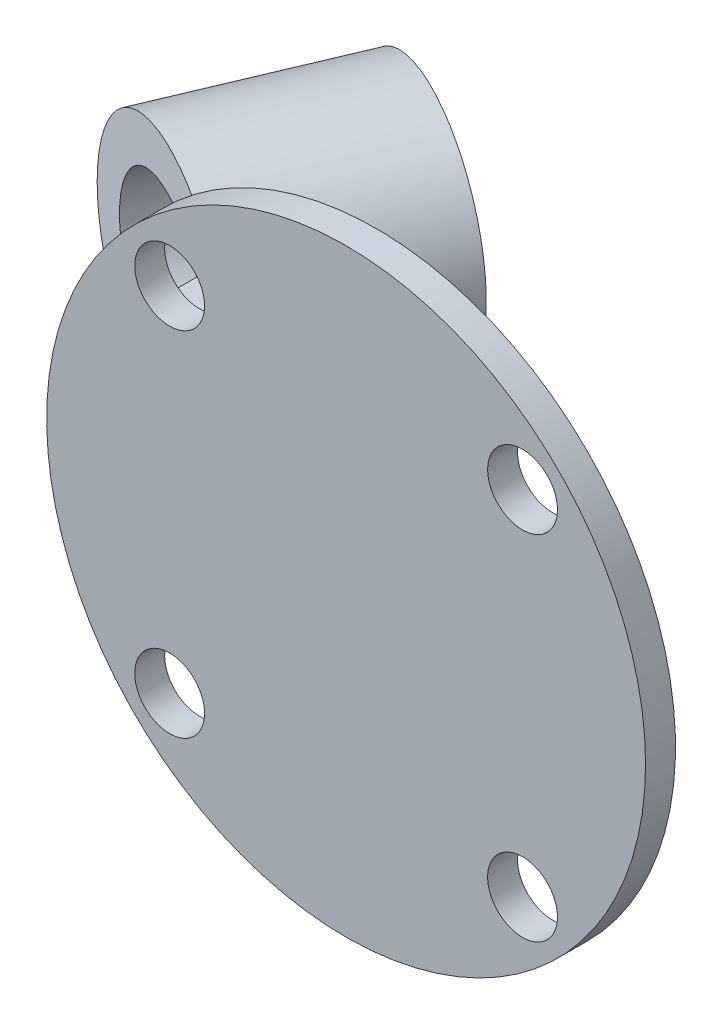
ISO-10303-21;
HEADER;
FILE_DESCRIPTION(('STEP AP214'),'2;1');
FILE_NAME('part.step','',(''),(''),'','','');
FILE_SCHEMA(('AUTOMOTIVE_DESIGN { 1 0 10303 214 1 1 1 1 }'));
ENDSEC;
DATA;
#1=APPLICATION_CONTEXT('core data for automotive mechanical design processes');
#2=APPLICATION_PROTOCOL_DEFINITION('international standard','automotive_design',2000,#1);
#3=PRODUCT_CONTEXT('',#1,'mechanical');
#4=PRODUCT('Part','Part','',(#3));
#5=PRODUCT_RELATED_PRODUCT_CATEGORY('part','',(#4));
#6=PRODUCT_DEFINITION_FORMATION('','',#4);
#7=PRODUCT_DEFINITION_CONTEXT('part definition',#1,'design');
#8=PRODUCT_DEFINITION('design','',#6,#7);
#9=PRODUCT_DEFINITION_SHAPE('','',#8);
#10=(LENGTH_UNIT() NAMED_UNIT(*) SI_UNIT(.MILLI.,.METRE.));
#11=(NAMED_UNIT(*) PLANE_ANGLE_UNIT() SI_UNIT($,.RADIAN.));
#12=(NAMED_UNIT(*) SI_UNIT($,.STERADIAN.) SOLID_ANGLE_UNIT());
#13=UNCERTAINTY_MEASURE_WITH_UNIT(LENGTH_MEASURE(1.E-05),#10,'distance_accuracy_value','');
#14=(GEOMETRIC_REPRESENTATION_CONTEXT(3) GLOBAL_UNCERTAINTY_ASSIGNED_CONTEXT((#13)) GLOBAL_UNIT_ASSIGNED_CONTEXT((#10,
#11,#12)) REPRESENTATION_CONTEXT('',''));
#15=CARTESIAN_POINT('',(0.,0.,0.));
#16=DIRECTION('',(0.,0.,1.));
#17=DIRECTION('',(1.,0.,0.));
#18=AXIS2_PLACEMENT_3D('',#15,#16,#17);
#19=CARTESIAN_POINT('',(-23.9445840321487,5.,-15.3333333333333));
#20=DIRECTION('',(-0.388888888888893,0.,0.921284663987609));
#21=DIRECTION('',(0.921284663987609,0.,0.388888888888893));
#22=AXIS2_PLACEMENT_3D('',#19,#20,#21);
#23=PLANE('',#22);
#24=CARTESIAN_POINT('',(-35.,0.,-20.));
#25=DIRECTION('',(-0.388888888888893,0.,0.921284663987609));
#26=DIRECTION('',(0.921284663987609,0.,0.388888888888893));
#27=AXIS2_PLACEMENT_3D('',#24,#25,#26);
#28=CIRCLE('',#27,12.);
#29=CARTESIAN_POINT('',(-23.9445840321487,0.,-15.3333333333333));
#30=VERTEX_POINT('',#29);
#31=CARTESIAN_POINT('',(-24.9499708249303,-5.,-15.7577230665305));
#32=VERTEX_POINT('',#31);
#33=EDGE_CURVE('E51',#30,#32,#28,.F.);
#34=ORIENTED_EDGE('',*,*,#33,.F.);
#35=DIRECTION('',(0.,-1.,0.));
#36=VECTOR('',#35,1.);
#37=CARTESIAN_POINT('',(-23.9445840321487,5.,-15.3333333333333));
#38=LINE('',#37,#36);
#39=CARTESIAN_POINT('',(-23.9445840321487,-5.,-15.3333333333333));
#40=VERTEX_POINT('',#39);
#41=EDGE_CURVE('E144',#30,#40,#38,.T.);
#42=ORIENTED_EDGE('',*,*,#41,.T.);
#43=DIRECTION('',(-0.921284663987609,0.,-0.388888888888893));
#44=VECTOR('',#43,1.);
#45=CARTESIAN_POINT('',(-23.9445840321487,-5.,-15.3333333333333));
#46=LINE('',#45,#44);
#47=EDGE_CURVE('E137',#40,#32,#46,.T.);
#48=ORIENTED_EDGE('',*,*,#47,.T.);
#49=EDGE_LOOP('',(#34,#42,#48));
#50=FACE_BOUND('',#49,.T.);
#51=ADVANCED_FACE('F36',(#50),#23,.F.);
#52=CARTESIAN_POINT('',(0.,5.,0.));
#53=DIRECTION('',(0.,-1.,0.));
#54=DIRECTION('',(0.,0.,-1.));
#55=AXIS2_PLACEMENT_3D('',#52,#53,#54);
#56=PLANE('',#55);
#57=DIRECTION('',(0.92128466398761,0.,0.388888888888891));
#58=VECTOR('',#57,1.);
#59=CARTESIAN_POINT('',(-0.0721069344173924,5.,0.170822604460895));
#60=LINE('',#59,#58);
#61=CARTESIAN_POINT('',(-29.7584240653411,5.,-12.3602433467286));
#62=VERTEX_POINT('',#61);
#63=CARTESIAN_POINT('',(-26.8944152693747,5.,-11.1512997465925));
#64=VERTEX_POINT('',#63);
#65=EDGE_CURVE('E107',#62,#64,#60,.T.);
#66=ORIENTED_EDGE('',*,*,#65,.F.);
#67=DIRECTION('',(0.,0.,1.));
#68=VECTOR('',#67,1.);
#69=CARTESIAN_POINT('',(-29.7584240653411,5.,-12.3602433467286));
#70=LINE('',#69,#68);
#71=CARTESIAN_POINT('',(-29.7584240653411,5.,0.));
#72=VERTEX_POINT('',#71);
#73=EDGE_CURVE('E134',#62,#72,#70,.T.);
#74=ORIENTED_EDGE('',*,*,#73,.T.);
#75=DIRECTION('',(1.,0.,0.));
#76=VECTOR('',#75,1.);
#77=CARTESIAN_POINT('',(-29.7584240653411,5.,0.));
#78=LINE('',#77,#76);
#79=CARTESIAN_POINT('',(-29.5803989154981,5.,0.));
#80=VERTEX_POINT('',#79);
#81=EDGE_CURVE('E136',#72,#80,#78,.T.);
#82=ORIENTED_EDGE('',*,*,#81,.T.);
#83=CARTESIAN_POINT('',(0.,5.,0.));
#84=VERTEX_POINT('',#83);
#85=EDGE_CURVE('E141',#80,#84,#78,.T.);
#86=ORIENTED_EDGE('',*,*,#85,.T.);
#87=DIRECTION('',(-0.842130858897415,0.,-0.539273229905493));
#88=VECTOR('',#87,1.);
#89=CARTESIAN_POINT('',(0.,5.,0.));
#90=LINE('',#89,#88);
#91=CARTESIAN_POINT('',(-23.9445840321487,5.,-15.3333333333333));
#92=VERTEX_POINT('',#91);
#93=EDGE_CURVE('E140',#84,#92,#90,.T.);
#94=ORIENTED_EDGE('',*,*,#93,.T.);
#95=DIRECTION('',(-0.921284663987609,0.,-0.388888888888893));
#96=VECTOR('',#95,1.);
#97=CARTESIAN_POINT('',(-23.9445840321487,5.,-15.3333333333333));
#98=LINE('',#97,#96);
#99=CARTESIAN_POINT('',(-24.9499708249303,5.,-15.7577230665305));
#100=VERTEX_POINT('',#99);
#101=EDGE_CURVE('E128',#92,#100,#98,.T.);
#102=ORIENTED_EDGE('',*,*,#101,.T.);
#103=DIRECTION('',(0.388888888888891,0.,-0.92128466398761));
#104=VECTOR('',#103,1.);
#105=CARTESIAN_POINT('',(-24.9499708249303,5.,-15.7577230665305));
#106=LINE('',#105,#104);
#107=EDGE_CURVE('E121',#64,#100,#106,.T.);
#108=ORIENTED_EDGE('',*,*,#107,.F.);
#109=EDGE_LOOP('',(#66,#74,#82,#86,#94,#102,#108));
#110=FACE_BOUND('',#109,.T.);
#111=ADVANCED_FACE('F126',(#110),#56,.F.);
#112=CARTESIAN_POINT('',(0.,-5.,0.));
#113=DIRECTION('',(0.,-1.,0.));
#114=DIRECTION('',(0.,0.,-1.));
#115=AXIS2_PLACEMENT_3D('',#112,#113,#114);
#116=PLANE('',#115);
#117=DIRECTION('',(0.,0.,1.));
#118=VECTOR('',#117,1.);
#119=CARTESIAN_POINT('',(-29.7584240653411,-5.,-12.3602433467286));
#120=LINE('',#119,#118);
#121=CARTESIAN_POINT('',(-29.7584240653411,-5.,-12.3602433467286));
#122=VERTEX_POINT('',#121);
#123=CARTESIAN_POINT('',(-29.7584240653411,-5.,0.));
#124=VERTEX_POINT('',#123);
#125=EDGE_CURVE('E117',#122,#124,#120,.T.);
#126=ORIENTED_EDGE('',*,*,#125,.F.);
#127=DIRECTION('',(0.92128466398761,0.,0.388888888888891));
#128=VECTOR('',#127,1.);
#129=CARTESIAN_POINT('',(-0.0721069344173924,-5.,0.170822604460895));
#130=LINE('',#129,#128);
#131=CARTESIAN_POINT('',(-26.8944152693747,-5.,-11.1512997465925));
#132=VERTEX_POINT('',#131);
#133=EDGE_CURVE('E11',#122,#132,#130,.T.);
#134=ORIENTED_EDGE('',*,*,#133,.T.);
#135=DIRECTION('',(0.388888888888891,0.,-0.92128466398761));
#136=VECTOR('',#135,1.);
#137=CARTESIAN_POINT('',(-24.9499708249303,-5.,-15.7577230665305));
#138=LINE('',#137,#136);
#139=EDGE_CURVE('E44',#132,#32,#138,.T.);
#140=ORIENTED_EDGE('',*,*,#139,.T.);
#141=ORIENTED_EDGE('',*,*,#47,.F.);
#142=DIRECTION('',(-0.842130858897415,0.,-0.539273229905493));
#143=VECTOR('',#142,1.);
#144=CARTESIAN_POINT('',(0.,-5.,0.));
#145=LINE('',#144,#143);
#146=CARTESIAN_POINT('',(0.,-5.,0.));
#147=VERTEX_POINT('',#146);
#148=EDGE_CURVE('E149',#147,#40,#145,.T.);
#149=ORIENTED_EDGE('',*,*,#148,.F.);
#150=DIRECTION('',(1.,0.,0.));
#151=VECTOR('',#150,1.);
#152=CARTESIAN_POINT('',(-29.7584240653411,-5.,0.));
#153=LINE('',#152,#151);
#154=CARTESIAN_POINT('',(-29.5803989154981,-5.,0.));
#155=VERTEX_POINT('',#154);
#156=EDGE_CURVE('E150',#155,#147,#153,.T.);
#157=ORIENTED_EDGE('',*,*,#156,.F.);
#158=EDGE_CURVE('E146',#124,#155,#153,.T.);
#159=ORIENTED_EDGE('',*,*,#158,.F.);
#160=EDGE_LOOP('',(#126,#134,#140,#141,#149,#157,#159));
#161=FACE_BOUND('',#160,.T.);
#162=ADVANCED_FACE('F216',(#161),#116,.T.);
#163=CARTESIAN_POINT('',(0.,0.,0.));
#164=DIRECTION('',(0.,0.,1.));
#165=DIRECTION('',(1.,0.,0.));
#166=AXIS2_PLACEMENT_3D('',#163,#164,#165);
#167=PLANE('',#166);
#168=CARTESIAN_POINT('',(-17.6776695296637,17.6776695296637,0.));
#169=DIRECTION('',(0.,0.,1.));
#170=DIRECTION('',(1.,0.,0.));
#171=AXIS2_PLACEMENT_3D('',#168,#169,#170);
#172=CIRCLE('',#171,3.5);
#173=CARTESIAN_POINT('',(-14.1776695296637,17.6776695296637,0.));
#174=VERTEX_POINT('',#173);
#175=EDGE_CURVE('E184',#174,#174,#172,.T.);
#176=ORIENTED_EDGE('',*,*,#175,.T.);
#177=EDGE_LOOP('',(#176));
#178=FACE_BOUND('',#177,.T.);
#179=CARTESIAN_POINT('',(17.6776695296637,17.6776695296637,0.));
#180=DIRECTION('',(0.,0.,1.));
#181=DIRECTION('',(-1.,0.,0.));
#182=AXIS2_PLACEMENT_3D('',#179,#180,#181);
#183=CIRCLE('',#182,3.5);
#184=CARTESIAN_POINT('',(14.1776695296637,17.6776695296637,0.));
#185=VERTEX_POINT('',#184);
#186=EDGE_CURVE('E166',#185,#185,#183,.T.);
#187=ORIENTED_EDGE('',*,*,#186,.T.);
#188=EDGE_LOOP('',(#187));
#189=FACE_BOUND('',#188,.T.);
#190=CARTESIAN_POINT('',(17.6776695296637,-17.6776695296637,0.));
#191=DIRECTION('',(0.,0.,1.));
#192=DIRECTION('',(1.,0.,0.));
#193=AXIS2_PLACEMENT_3D('',#190,#191,#192);
#194=CIRCLE('',#193,3.5);
#195=CARTESIAN_POINT('',(21.1776695296637,-17.6776695296637,0.));
#196=VERTEX_POINT('',#195);
#197=EDGE_CURVE('E173',#196,#196,#194,.T.);
#198=ORIENTED_EDGE('',*,*,#197,.T.);
#199=EDGE_LOOP('',(#198));
#200=FACE_BOUND('',#199,.T.);
#201=CARTESIAN_POINT('',(-17.6776695296637,-17.6776695296637,0.));
#202=DIRECTION('',(0.,0.,1.));
#203=DIRECTION('',(-1.,0.,0.));
#204=AXIS2_PLACEMENT_3D('',#201,#202,#203);
#205=CIRCLE('',#204,3.5);
#206=CARTESIAN_POINT('',(-21.1776695296637,-17.6776695296637,0.));
#207=VERTEX_POINT('',#206);
#208=EDGE_CURVE('E179',#207,#207,#205,.T.);
#209=ORIENTED_EDGE('',*,*,#208,.T.);
#210=EDGE_LOOP('',(#209));
#211=FACE_BOUND('',#210,.T.);
#212=CARTESIAN_POINT('',(0.,0.,0.));
#213=DIRECTION('',(0.,0.,1.));
#214=DIRECTION('',(1.,0.,0.));
#215=AXIS2_PLACEMENT_3D('',#212,#213,#214);
#216=CIRCLE('',#215,30.);
#217=EDGE_CURVE('E187',#155,#80,#216,.T.);
#218=ORIENTED_EDGE('',*,*,#217,.F.);
#219=ORIENTED_EDGE('',*,*,#156,.T.);
#220=DIRECTION('',(0.,-1.,0.));
#221=VECTOR('',#220,1.);
#222=CARTESIAN_POINT('',(0.,5.,0.));
#223=LINE('',#222,#221);
#224=EDGE_CURVE('E158',#84,#147,#223,.T.);
#225=ORIENTED_EDGE('',*,*,#224,.F.);
#226=ORIENTED_EDGE('',*,*,#85,.F.);
#227=EDGE_LOOP('',(#218,#219,#225,#226));
#228=FACE_BOUND('',#227,.T.);
#229=ADVANCED_FACE('F222',(#178,#189,#200,#211,#228),#167,.F.);
#230=CARTESIAN_POINT('',(0.,0.,3.));
#231=DIRECTION('',(0.,0.,-1.));
#232=DIRECTION('',(-1.,0.,0.));
#233=AXIS2_PLACEMENT_3D('',#230,#231,#232);
#234=CYLINDRICAL_SURFACE('',#233,30.);
#235=CARTESIAN_POINT('',(0.,0.,3.));
#236=DIRECTION('',(0.,0.,1.));
#237=DIRECTION('',(1.,0.,0.));
#238=AXIS2_PLACEMENT_3D('',#235,#236,#237);
#239=CIRCLE('',#238,30.);
#240=CARTESIAN_POINT('',(30.,0.,3.));
#241=VERTEX_POINT('',#240);
#242=EDGE_CURVE('E190',#241,#241,#239,.T.);
#243=ORIENTED_EDGE('',*,*,#242,.F.);
#244=EDGE_LOOP('',(#243));
#245=FACE_BOUND('',#244,.T.);
#246=CARTESIAN_POINT('',(-29.7584240653411,3.79949959169974,0.));
#247=VERTEX_POINT('',#246);
#248=EDGE_CURVE('E193',#80,#247,#216,.T.);
#249=ORIENTED_EDGE('',*,*,#248,.T.);
#250=CARTESIAN_POINT('',(-29.7584240653411,-3.79949959169974,0.));
#251=VERTEX_POINT('',#250);
#252=EDGE_CURVE('E195',#247,#251,#216,.T.);
#253=ORIENTED_EDGE('',*,*,#252,.T.);
#254=EDGE_CURVE('E212',#251,#155,#216,.T.);
#255=ORIENTED_EDGE('',*,*,#254,.T.);
#256=ORIENTED_EDGE('',*,*,#217,.T.);
#257=EDGE_LOOP('',(#249,#253,#255,#256));
#258=FACE_BOUND('',#257,.T.);
#259=ADVANCED_FACE('F38',(#245,#258),#234,.T.);
#260=CARTESIAN_POINT('',(0.,0.,3.));
#261=DIRECTION('',(0.,0.,1.));
#262=DIRECTION('',(1.,0.,0.));
#263=AXIS2_PLACEMENT_3D('',#260,#261,#262);
#264=PLANE('',#263);
#265=CARTESIAN_POINT('',(-17.6776695296637,-17.6776695296637,3.));
#266=DIRECTION('',(0.,0.,1.));
#267=DIRECTION('',(-1.,0.,0.));
#268=AXIS2_PLACEMENT_3D('',#265,#266,#267);
#269=CIRCLE('',#268,3.5);
#270=CARTESIAN_POINT('',(-21.1776695296637,-17.6776695296637,3.));
#271=VERTEX_POINT('',#270);
#272=EDGE_CURVE('E165',#271,#271,#269,.T.);
#273=ORIENTED_EDGE('',*,*,#272,.F.);
#274=EDGE_LOOP('',(#273));
#275=FACE_BOUND('',#274,.T.);
#276=CARTESIAN_POINT('',(17.6776695296637,-17.6776695296637,3.));
#277=DIRECTION('',(0.,0.,1.));
#278=DIRECTION('',(1.,0.,0.));
#279=AXIS2_PLACEMENT_3D('',#276,#277,#278);
#280=CIRCLE('',#279,3.5);
#281=CARTESIAN_POINT('',(21.1776695296637,-17.6776695296637,3.));
#282=VERTEX_POINT('',#281);
#283=EDGE_CURVE('E176',#282,#282,#280,.T.);
#284=ORIENTED_EDGE('',*,*,#283,.F.);
#285=EDGE_LOOP('',(#284));
#286=FACE_BOUND('',#285,.T.);
#287=CARTESIAN_POINT('',(17.6776695296637,17.6776695296637,3.));
#288=DIRECTION('',(0.,0.,1.));
#289=DIRECTION('',(-1.,0.,0.));
#290=AXIS2_PLACEMENT_3D('',#287,#288,#289);
#291=CIRCLE('',#290,3.5);
#292=CARTESIAN_POINT('',(14.1776695296637,17.6776695296637,3.));
#293=VERTEX_POINT('',#292);
#294=EDGE_CURVE('E170',#293,#293,#291,.T.);
#295=ORIENTED_EDGE('',*,*,#294,.F.);
#296=EDGE_LOOP('',(#295));
#297=FACE_BOUND('',#296,.T.);
#298=CARTESIAN_POINT('',(-17.6776695296637,17.6776695296637,3.));
#299=DIRECTION('',(0.,0.,1.));
#300=DIRECTION('',(1.,0.,0.));
#301=AXIS2_PLACEMENT_3D('',#298,#299,#300);
#302=CIRCLE('',#301,3.5);
#303=CARTESIAN_POINT('',(-14.1776695296637,17.6776695296637,3.));
#304=VERTEX_POINT('',#303);
#305=EDGE_CURVE('E169',#304,#304,#302,.T.);
#306=ORIENTED_EDGE('',*,*,#305,.F.);
#307=EDGE_LOOP('',(#306));
#308=FACE_BOUND('',#307,.T.);
#309=ORIENTED_EDGE('',*,*,#242,.T.);
#310=EDGE_LOOP('',(#309));
#311=FACE_BOUND('',#310,.T.);
#312=ADVANCED_FACE('F228',(#275,#286,#297,#308,#311),#264,.T.);
#313=ORIENTED_EDGE('',*,*,#252,.F.);
#314=DIRECTION('',(0.,-1.,0.));
#315=VECTOR('',#314,1.);
#316=CARTESIAN_POINT('',(-29.7584240653411,5.,0.));
#317=LINE('',#316,#315);
#318=EDGE_CURVE('E163',#247,#251,#317,.T.);
#319=ORIENTED_EDGE('',*,*,#318,.T.);
#320=EDGE_LOOP('',(#313,#319));
#321=FACE_BOUND('',#320,.T.);
#322=ADVANCED_FACE('F225',(#321),#167,.F.);
#323=CARTESIAN_POINT('',(-17.6776695296637,17.6776695296637,0.));
#324=DIRECTION('',(0.,0.,1.));
#325=DIRECTION('',(1.,0.,0.));
#326=AXIS2_PLACEMENT_3D('',#323,#324,#325);
#327=CYLINDRICAL_SURFACE('',#326,3.5);
#328=ORIENTED_EDGE('',*,*,#175,.F.);
#329=EDGE_LOOP('',(#328));
#330=FACE_BOUND('',#329,.T.);
#331=ORIENTED_EDGE('',*,*,#305,.T.);
#332=EDGE_LOOP('',(#331));
#333=FACE_BOUND('',#332,.T.);
#334=ADVANCED_FACE('F227',(#330,#333),#327,.F.);
#335=CARTESIAN_POINT('',(17.6776695296637,17.6776695296637,0.));
#336=DIRECTION('',(0.,0.,1.));
#337=DIRECTION('',(1.,0.,0.));
#338=AXIS2_PLACEMENT_3D('',#335,#336,#337);
#339=CYLINDRICAL_SURFACE('',#338,3.5);
#340=ORIENTED_EDGE('',*,*,#186,.F.);
#341=EDGE_LOOP('',(#340));
#342=FACE_BOUND('',#341,.T.);
#343=ORIENTED_EDGE('',*,*,#294,.T.);
#344=EDGE_LOOP('',(#343));
#345=FACE_BOUND('',#344,.T.);
#346=ADVANCED_FACE('F233',(#342,#345),#339,.F.);
#347=CARTESIAN_POINT('',(17.6776695296637,-17.6776695296637,0.));
#348=DIRECTION('',(0.,0.,1.));
#349=DIRECTION('',(1.,0.,0.));
#350=AXIS2_PLACEMENT_3D('',#347,#348,#349);
#351=CYLINDRICAL_SURFACE('',#350,3.5);
#352=ORIENTED_EDGE('',*,*,#197,.F.);
#353=EDGE_LOOP('',(#352));
#354=FACE_BOUND('',#353,.T.);
#355=ORIENTED_EDGE('',*,*,#283,.T.);
#356=EDGE_LOOP('',(#355));
#357=FACE_BOUND('',#356,.T.);
#358=ADVANCED_FACE('F267',(#354,#357),#351,.F.);
#359=CARTESIAN_POINT('',(-17.6776695296637,-17.6776695296637,0.));
#360=DIRECTION('',(0.,0.,1.));
#361=DIRECTION('',(1.,0.,0.));
#362=AXIS2_PLACEMENT_3D('',#359,#360,#361);
#363=CYLINDRICAL_SURFACE('',#362,3.5);
#364=ORIENTED_EDGE('',*,*,#208,.F.);
#365=EDGE_LOOP('',(#364));
#366=FACE_BOUND('',#365,.T.);
#367=ORIENTED_EDGE('',*,*,#272,.T.);
#368=EDGE_LOOP('',(#367));
#369=FACE_BOUND('',#368,.T.);
#370=ADVANCED_FACE('F271',(#366,#369),#363,.F.);
#371=CARTESIAN_POINT('',(-29.7584240653411,5.,0.));
#372=DIRECTION('',(0.,0.,-1.));
#373=DIRECTION('',(-1.,0.,0.));
#374=AXIS2_PLACEMENT_3D('',#371,#372,#373);
#375=PLANE('',#374);
#376=ORIENTED_EDGE('',*,*,#248,.F.);
#377=ORIENTED_EDGE('',*,*,#81,.F.);
#378=EDGE_CURVE('E160',#72,#247,#317,.T.);
#379=ORIENTED_EDGE('',*,*,#378,.T.);
#380=EDGE_LOOP('',(#376,#377,#379));
#381=FACE_BOUND('',#380,.T.);
#382=ADVANCED_FACE('F261',(#381),#375,.F.);
#383=CARTESIAN_POINT('',(-29.7584240653411,5.,-12.3602433467286));
#384=DIRECTION('',(1.,0.,0.));
#385=DIRECTION('',(0.,0.,-1.));
#386=AXIS2_PLACEMENT_3D('',#383,#384,#385);
#387=PLANE('',#386);
#388=ORIENTED_EDGE('',*,*,#125,.T.);
#389=EDGE_CURVE('E59',#251,#124,#317,.T.);
#390=ORIENTED_EDGE('',*,*,#389,.F.);
#391=ORIENTED_EDGE('',*,*,#318,.F.);
#392=ORIENTED_EDGE('',*,*,#378,.F.);
#393=ORIENTED_EDGE('',*,*,#73,.F.);
#394=DIRECTION('',(0.,-1.,0.));
#395=VECTOR('',#394,1.);
#396=CARTESIAN_POINT('',(-29.7584240653411,5.,-12.3602433467286));
#397=LINE('',#396,#395);
#398=CARTESIAN_POINT('',(-29.7584240653411,0.,-12.3602433467286));
#399=VERTEX_POINT('',#398);
#400=EDGE_CURVE('E113',#62,#399,#397,.T.);
#401=ORIENTED_EDGE('',*,*,#400,.T.);
#402=DIRECTION('',(0.,1.,0.));
#403=VECTOR('',#402,1.);
#404=CARTESIAN_POINT('',(-29.7584240653411,5.,-12.3602433467286));
#405=LINE('',#404,#403);
#406=EDGE_CURVE('E118',#122,#399,#405,.T.);
#407=ORIENTED_EDGE('',*,*,#406,.F.);
#408=EDGE_LOOP('',(#388,#390,#391,#392,#393,#401,#407));
#409=FACE_BOUND('',#408,.T.);
#410=ADVANCED_FACE('F215',(#409),#387,.F.);
#411=ORIENTED_EDGE('',*,*,#254,.F.);
#412=ORIENTED_EDGE('',*,*,#389,.T.);
#413=ORIENTED_EDGE('',*,*,#158,.T.);
#414=EDGE_LOOP('',(#411,#412,#413));
#415=FACE_BOUND('',#414,.T.);
#416=ADVANCED_FACE('F209',(#415),#375,.F.);
#417=CARTESIAN_POINT('',(0.,5.,0.));
#418=DIRECTION('',(-0.539273229905493,0.,0.842130858897415));
#419=DIRECTION('',(0.842130858897415,0.,0.539273229905493));
#420=AXIS2_PLACEMENT_3D('',#417,#418,#419);
#421=PLANE('',#420);
#422=ORIENTED_EDGE('',*,*,#148,.T.);
#423=ORIENTED_EDGE('',*,*,#41,.F.);
#424=EDGE_CURVE('E155',#92,#30,#38,.T.);
#425=ORIENTED_EDGE('',*,*,#424,.F.);
#426=ORIENTED_EDGE('',*,*,#93,.F.);
#427=ORIENTED_EDGE('',*,*,#224,.T.);
#428=EDGE_LOOP('',(#422,#423,#425,#426,#427));
#429=FACE_BOUND('',#428,.T.);
#430=ADVANCED_FACE('F220',(#429),#421,.F.);
#431=EDGE_CURVE('E129',#100,#30,#28,.F.);
#432=ORIENTED_EDGE('',*,*,#431,.F.);
#433=ORIENTED_EDGE('',*,*,#101,.F.);
#434=ORIENTED_EDGE('',*,*,#424,.T.);
#435=EDGE_LOOP('',(#432,#433,#434));
#436=FACE_BOUND('',#435,.T.);
#437=ADVANCED_FACE('F243',(#436),#23,.F.);
#438=CARTESIAN_POINT('',(-29.7584240653411,0.,-12.3602433467286));
#439=DIRECTION('',(0.388888888888891,0.,-0.92128466398761));
#440=DIRECTION('',(-0.92128466398761,0.,-0.388888888888891));
#441=AXIS2_PLACEMENT_3D('',#438,#439,#440);
#442=PLANE('',#441);
#443=ORIENTED_EDGE('',*,*,#400,.F.);
#444=ORIENTED_EDGE('',*,*,#65,.T.);
#445=CARTESIAN_POINT('',(-36.9444444444445,0.,-15.3935766800619));
#446=DIRECTION('',(0.388888888888891,0.,-0.92128466398761));
#447=DIRECTION('',(-0.92128466398761,0.,-0.388888888888891));
#448=AXIS2_PLACEMENT_3D('',#445,#446,#447);
#449=CIRCLE('',#448,12.);
#450=EDGE_CURVE('E110',#132,#64,#449,.T.);
#451=ORIENTED_EDGE('',*,*,#450,.F.);
#452=ORIENTED_EDGE('',*,*,#133,.F.);
#453=ORIENTED_EDGE('',*,*,#406,.T.);
#454=CARTESIAN_POINT('',(-36.9444444444445,0.,-15.3935766800619));
#455=DIRECTION('',(0.388888888888891,0.,-0.92128466398761));
#456=DIRECTION('',(-0.92128466398761,0.,-0.388888888888891));
#457=AXIS2_PLACEMENT_3D('',#454,#455,#456);
#458=CIRCLE('',#457,7.79999999999999);
#459=EDGE_CURVE('E386',#399,#399,#458,.T.);
#460=ORIENTED_EDGE('',*,*,#459,.T.);
#461=EDGE_LOOP('',(#443,#444,#451,#452,#453,#460));
#462=FACE_BOUND('',#461,.T.);
#463=ADVANCED_FACE('F109',(#462),#442,.F.);
#464=CARTESIAN_POINT('',(-35.,0.,-20.));
#465=DIRECTION('',(0.388888888888891,0.,-0.92128466398761));
#466=DIRECTION('',(-0.92128466398761,0.,-0.388888888888891));
#467=AXIS2_PLACEMENT_3D('',#464,#465,#466);
#468=CYLINDRICAL_SURFACE('',#467,12.);
#469=CARTESIAN_POINT('',(-29.1666666666666,0.,-33.8192699598141));
#470=DIRECTION('',(0.388888888888891,0.,-0.92128466398761));
#471=DIRECTION('',(-0.92128466398761,0.,-0.388888888888891));
#472=AXIS2_PLACEMENT_3D('',#469,#470,#471);
#473=CIRCLE('',#472,12.);
#474=CARTESIAN_POINT('',(-40.222082634518,0.,-38.4859366264808));
#475=VERTEX_POINT('',#474);
#476=EDGE_CURVE('E123',#475,#475,#473,.T.);
#477=ORIENTED_EDGE('',*,*,#476,.F.);
#478=EDGE_LOOP('',(#477));
#479=FACE_BOUND('',#478,.T.);
#480=ORIENTED_EDGE('',*,*,#450,.T.);
#481=ORIENTED_EDGE('',*,*,#107,.T.);
#482=ORIENTED_EDGE('',*,*,#431,.T.);
#483=ORIENTED_EDGE('',*,*,#33,.T.);
#484=ORIENTED_EDGE('',*,*,#139,.F.);
#485=EDGE_LOOP('',(#480,#481,#482,#483,#484));
#486=FACE_BOUND('',#485,.T.);
#487=ADVANCED_FACE('F120',(#479,#486),#468,.T.);
#488=CARTESIAN_POINT('',(-18.1112506988153,0.,-29.1526032931475));
#489=DIRECTION('',(-0.388888888888891,0.,0.92128466398761));
#490=DIRECTION('',(0.92128466398761,0.,0.388888888888891));
#491=AXIS2_PLACEMENT_3D('',#488,#489,#490);
#492=PLANE('',#491);
#493=CARTESIAN_POINT('',(-29.1666666666666,0.,-33.8192699598142));
#494=DIRECTION('',(0.388888888888891,0.,-0.92128466398761));
#495=DIRECTION('',(-0.92128466398761,0.,-0.388888888888891));
#496=AXIS2_PLACEMENT_3D('',#493,#494,#495);
#497=CIRCLE('',#496,8.34558700000001);
#498=CARTESIAN_POINT('',(-36.855327981741,0.,-37.0647760153697));
#499=VERTEX_POINT('',#498);
#500=EDGE_CURVE('E389',#499,#499,#497,.T.);
#501=ORIENTED_EDGE('',*,*,#500,.F.);
#502=EDGE_LOOP('',(#501));
#503=FACE_BOUND('',#502,.T.);
#504=ORIENTED_EDGE('',*,*,#476,.T.);
#505=EDGE_LOOP('',(#504));
#506=FACE_BOUND('',#505,.T.);
#507=ADVANCED_FACE('F361',(#503,#506),#492,.F.);
#508=CARTESIAN_POINT('',(-29.1666666666666,0.,-33.8192699598142));
#509=DIRECTION('',(0.388888888888891,0.,-0.92128466398761));
#510=DIRECTION('',(-0.92128466398761,0.,-0.388888888888891));
#511=AXIS2_PLACEMENT_3D('',#508,#509,#510);
#512=CONICAL_SURFACE('',#511,8.34558700000001,0.027272586259339);
#513=ORIENTED_EDGE('',*,*,#459,.F.);
#514=EDGE_LOOP('',(#513));
#515=FACE_BOUND('',#514,.T.);
#516=ORIENTED_EDGE('',*,*,#500,.T.);
#517=EDGE_LOOP('',(#516));
#518=FACE_BOUND('',#517,.T.);
#519=ADVANCED_FACE('F369',(#515,#518),#512,.F.);
#520=CLOSED_SHELL('',(#51,#111,#162,#229,#259,#312,#322,#334,#346,#358,#370,#382,#410,#416,#430,
#437,#463,#487,#507,#519));
#521=MANIFOLD_SOLID_BREP('B2',#520);
#522=ADVANCED_BREP_SHAPE_REPRESENTATION('',(#18,#521),#14);
#523=SHAPE_DEFINITION_REPRESENTATION(#9,#522);
ENDSEC;
END-ISO-10303-21;
